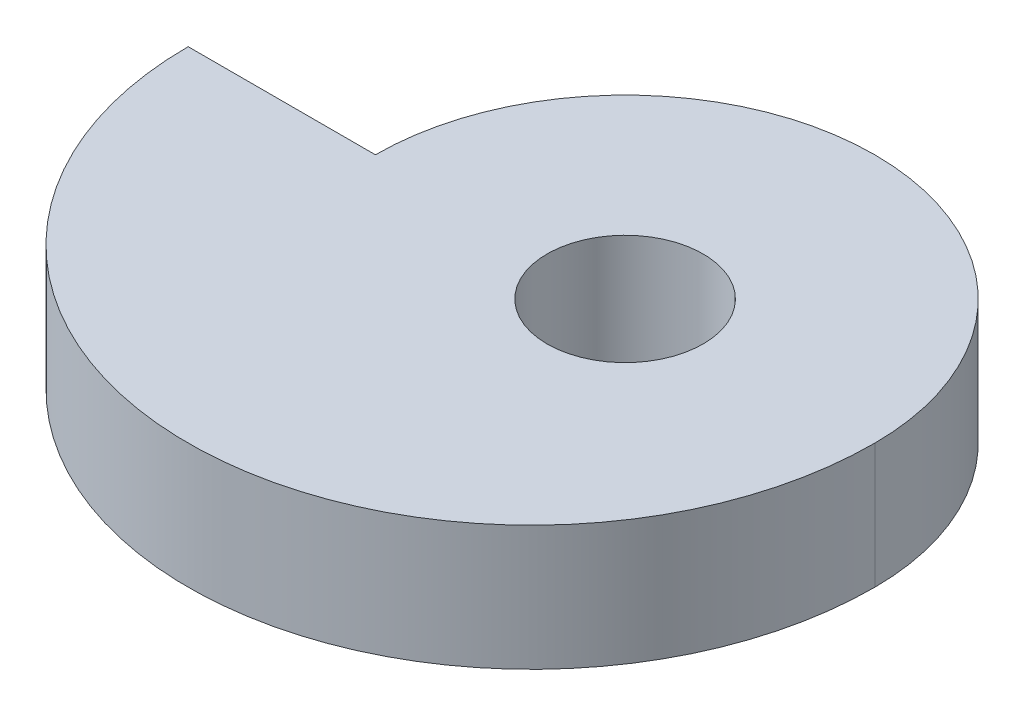
ISO-10303-21;
HEADER;
FILE_DESCRIPTION(('STEP AP214'),'2;1');
FILE_NAME('part.step','',(''),(''),'','','');
FILE_SCHEMA(('AUTOMOTIVE_DESIGN { 1 0 10303 214 1 1 1 1 }'));
ENDSEC;
DATA;
#1=APPLICATION_CONTEXT('core data for automotive mechanical design processes');
#2=APPLICATION_PROTOCOL_DEFINITION('international standard','automotive_design',2000,#1);
#3=PRODUCT_CONTEXT('',#1,'mechanical');
#4=PRODUCT('Part','Part','',(#3));
#5=PRODUCT_RELATED_PRODUCT_CATEGORY('part','',(#4));
#6=PRODUCT_DEFINITION_FORMATION('','',#4);
#7=PRODUCT_DEFINITION_CONTEXT('part definition',#1,'design');
#8=PRODUCT_DEFINITION('design','',#6,#7);
#9=PRODUCT_DEFINITION_SHAPE('','',#8);
#10=(LENGTH_UNIT() NAMED_UNIT(*) SI_UNIT(.MILLI.,.METRE.));
#11=(NAMED_UNIT(*) PLANE_ANGLE_UNIT() SI_UNIT($,.RADIAN.));
#12=(NAMED_UNIT(*) SI_UNIT($,.STERADIAN.) SOLID_ANGLE_UNIT());
#13=UNCERTAINTY_MEASURE_WITH_UNIT(LENGTH_MEASURE(1.E-05),#10,'distance_accuracy_value','');
#14=(GEOMETRIC_REPRESENTATION_CONTEXT(3) GLOBAL_UNCERTAINTY_ASSIGNED_CONTEXT((#13)) GLOBAL_UNIT_ASSIGNED_CONTEXT((#10,
#11,#12)) REPRESENTATION_CONTEXT('',''));
#15=CARTESIAN_POINT('',(0.,0.,0.));
#16=DIRECTION('',(0.,0.,1.));
#17=DIRECTION('',(1.,0.,0.));
#18=AXIS2_PLACEMENT_3D('',#15,#16,#17);
#19=CARTESIAN_POINT('',(-1.905,2.54,0.));
#20=DIRECTION('',(0.,-1.,0.));
#21=DIRECTION('',(0.,0.,-1.));
#22=AXIS2_PLACEMENT_3D('',#19,#20,#21);
#23=PLANE('',#22);
#24=CARTESIAN_POINT('',(-1.905,2.54,0.));
#25=DIRECTION('',(0.,1.,0.));
#26=DIRECTION('',(0.,0.,-1.));
#27=AXIS2_PLACEMENT_3D('',#24,#25,#26);
#28=CIRCLE('',#27,6.985);
#29=CARTESIAN_POINT('',(-8.89,2.54,0.));
#30=VERTEX_POINT('',#29);
#31=CARTESIAN_POINT('',(5.08,2.54,0.));
#32=VERTEX_POINT('',#31);
#33=EDGE_CURVE('E76',#30,#32,#28,.T.);
#34=ORIENTED_EDGE('',*,*,#33,.T.);
#35=CARTESIAN_POINT('',(0.,2.54,0.));
#36=DIRECTION('',(0.,1.,0.));
#37=DIRECTION('',(0.,0.,1.));
#38=AXIS2_PLACEMENT_3D('',#35,#36,#37);
#39=CIRCLE('',#38,5.08);
#40=CARTESIAN_POINT('',(-5.08,2.54,0.));
#41=VERTEX_POINT('',#40);
#42=EDGE_CURVE('E72',#32,#41,#39,.T.);
#43=ORIENTED_EDGE('',*,*,#42,.T.);
#44=DIRECTION('',(-1.,0.,0.));
#45=VECTOR('',#44,1.);
#46=CARTESIAN_POINT('',(-8.89,2.54,0.));
#47=LINE('',#46,#45);
#48=EDGE_CURVE('E52',#41,#30,#47,.T.);
#49=ORIENTED_EDGE('',*,*,#48,.T.);
#50=EDGE_LOOP('',(#34,#43,#49));
#51=FACE_BOUND('',#50,.T.);
#52=CARTESIAN_POINT('',(0.,2.54,0.));
#53=DIRECTION('',(0.,1.,0.));
#54=DIRECTION('',(0.,0.,1.));
#55=AXIS2_PLACEMENT_3D('',#52,#53,#54);
#56=CIRCLE('',#55,1.5875);
#57=CARTESIAN_POINT('',(0.,2.54,1.5875));
#58=VERTEX_POINT('',#57);
#59=EDGE_CURVE('E86',#58,#58,#56,.T.);
#60=ORIENTED_EDGE('',*,*,#59,.F.);
#61=EDGE_LOOP('',(#60));
#62=FACE_BOUND('',#61,.T.);
#63=ADVANCED_FACE('F35',(#51,#62),#23,.F.);
#64=CARTESIAN_POINT('',(-1.905,0.,0.));
#65=DIRECTION('',(0.,-1.,0.));
#66=DIRECTION('',(0.,0.,-1.));
#67=AXIS2_PLACEMENT_3D('',#64,#65,#66);
#68=PLANE('',#67);
#69=CARTESIAN_POINT('',(-1.905,0.,0.));
#70=DIRECTION('',(0.,1.,0.));
#71=DIRECTION('',(0.,0.,-1.));
#72=AXIS2_PLACEMENT_3D('',#69,#70,#71);
#73=CIRCLE('',#72,6.985);
#74=CARTESIAN_POINT('',(-8.89,0.,0.));
#75=VERTEX_POINT('',#74);
#76=CARTESIAN_POINT('',(5.08,0.,0.));
#77=VERTEX_POINT('',#76);
#78=EDGE_CURVE('E83',#75,#77,#73,.T.);
#79=ORIENTED_EDGE('',*,*,#78,.F.);
#80=DIRECTION('',(-1.,0.,0.));
#81=VECTOR('',#80,1.);
#82=CARTESIAN_POINT('',(-8.89,0.,0.));
#83=LINE('',#82,#81);
#84=CARTESIAN_POINT('',(-5.08,0.,0.));
#85=VERTEX_POINT('',#84);
#86=EDGE_CURVE('E69',#85,#75,#83,.T.);
#87=ORIENTED_EDGE('',*,*,#86,.F.);
#88=CARTESIAN_POINT('',(0.,0.,0.));
#89=DIRECTION('',(0.,1.,0.));
#90=DIRECTION('',(0.,0.,1.));
#91=AXIS2_PLACEMENT_3D('',#88,#89,#90);
#92=CIRCLE('',#91,5.08);
#93=EDGE_CURVE('E64',#77,#85,#92,.T.);
#94=ORIENTED_EDGE('',*,*,#93,.F.);
#95=EDGE_LOOP('',(#79,#87,#94));
#96=FACE_BOUND('',#95,.T.);
#97=CARTESIAN_POINT('',(0.,0.,0.));
#98=DIRECTION('',(0.,1.,0.));
#99=DIRECTION('',(0.,0.,1.));
#100=AXIS2_PLACEMENT_3D('',#97,#98,#99);
#101=CIRCLE('',#100,1.5875);
#102=CARTESIAN_POINT('',(0.,0.,1.5875));
#103=VERTEX_POINT('',#102);
#104=EDGE_CURVE('E90',#103,#103,#101,.T.);
#105=ORIENTED_EDGE('',*,*,#104,.T.);
#106=EDGE_LOOP('',(#105));
#107=FACE_BOUND('',#106,.T.);
#108=ADVANCED_FACE('F96',(#96,#107),#68,.T.);
#109=CARTESIAN_POINT('',(-1.905,2.54,0.));
#110=DIRECTION('',(0.,-1.,0.));
#111=DIRECTION('',(0.,0.,-1.));
#112=AXIS2_PLACEMENT_3D('',#109,#110,#111);
#113=CYLINDRICAL_SURFACE('',#112,6.985);
#114=ORIENTED_EDGE('',*,*,#78,.T.);
#115=DIRECTION('',(0.,-1.,0.));
#116=VECTOR('',#115,1.);
#117=CARTESIAN_POINT('',(5.08,2.54,0.));
#118=LINE('',#117,#116);
#119=EDGE_CURVE('E11',#32,#77,#118,.T.);
#120=ORIENTED_EDGE('',*,*,#119,.F.);
#121=ORIENTED_EDGE('',*,*,#33,.F.);
#122=DIRECTION('',(0.,-1.,0.));
#123=VECTOR('',#122,1.);
#124=CARTESIAN_POINT('',(-8.89,2.54,0.));
#125=LINE('',#124,#123);
#126=EDGE_CURVE('E84',#30,#75,#125,.T.);
#127=ORIENTED_EDGE('',*,*,#126,.T.);
#128=EDGE_LOOP('',(#114,#120,#121,#127));
#129=FACE_BOUND('',#128,.T.);
#130=ADVANCED_FACE('F37',(#129),#113,.T.);
#131=CARTESIAN_POINT('',(0.,2.54,0.));
#132=DIRECTION('',(0.,-1.,0.));
#133=DIRECTION('',(0.,0.,-1.));
#134=AXIS2_PLACEMENT_3D('',#131,#132,#133);
#135=CYLINDRICAL_SURFACE('',#134,5.08);
#136=ORIENTED_EDGE('',*,*,#93,.T.);
#137=DIRECTION('',(0.,-1.,0.));
#138=VECTOR('',#137,1.);
#139=CARTESIAN_POINT('',(-5.08,2.54,0.));
#140=LINE('',#139,#138);
#141=EDGE_CURVE('E44',#41,#85,#140,.T.);
#142=ORIENTED_EDGE('',*,*,#141,.F.);
#143=ORIENTED_EDGE('',*,*,#42,.F.);
#144=ORIENTED_EDGE('',*,*,#119,.T.);
#145=EDGE_LOOP('',(#136,#142,#143,#144));
#146=FACE_BOUND('',#145,.T.);
#147=ADVANCED_FACE('F73',(#146),#135,.T.);
#148=CARTESIAN_POINT('',(-8.89,2.54,0.));
#149=DIRECTION('',(0.,0.,1.));
#150=DIRECTION('',(1.,0.,0.));
#151=AXIS2_PLACEMENT_3D('',#148,#149,#150);
#152=PLANE('',#151);
#153=ORIENTED_EDGE('',*,*,#86,.T.);
#154=ORIENTED_EDGE('',*,*,#126,.F.);
#155=ORIENTED_EDGE('',*,*,#48,.F.);
#156=ORIENTED_EDGE('',*,*,#141,.T.);
#157=EDGE_LOOP('',(#153,#154,#155,#156));
#158=FACE_BOUND('',#157,.T.);
#159=ADVANCED_FACE('F95',(#158),#152,.F.);
#160=CARTESIAN_POINT('',(0.,2.54,0.));
#161=DIRECTION('',(0.,-1.,0.));
#162=DIRECTION('',(0.,0.,-1.));
#163=AXIS2_PLACEMENT_3D('',#160,#161,#162);
#164=CYLINDRICAL_SURFACE('',#163,1.5875);
#165=ORIENTED_EDGE('',*,*,#59,.T.);
#166=EDGE_LOOP('',(#165));
#167=FACE_BOUND('',#166,.T.);
#168=ORIENTED_EDGE('',*,*,#104,.F.);
#169=EDGE_LOOP('',(#168));
#170=FACE_BOUND('',#169,.T.);
#171=ADVANCED_FACE('F104',(#167,#170),#164,.F.);
#172=CLOSED_SHELL('',(#63,#108,#130,#147,#159,#171));
#173=MANIFOLD_SOLID_BREP('B2',#172);
#174=ADVANCED_BREP_SHAPE_REPRESENTATION('',(#18,#173),#14);
#175=SHAPE_DEFINITION_REPRESENTATION(#9,#174);
ENDSEC;
END-ISO-10303-21;
